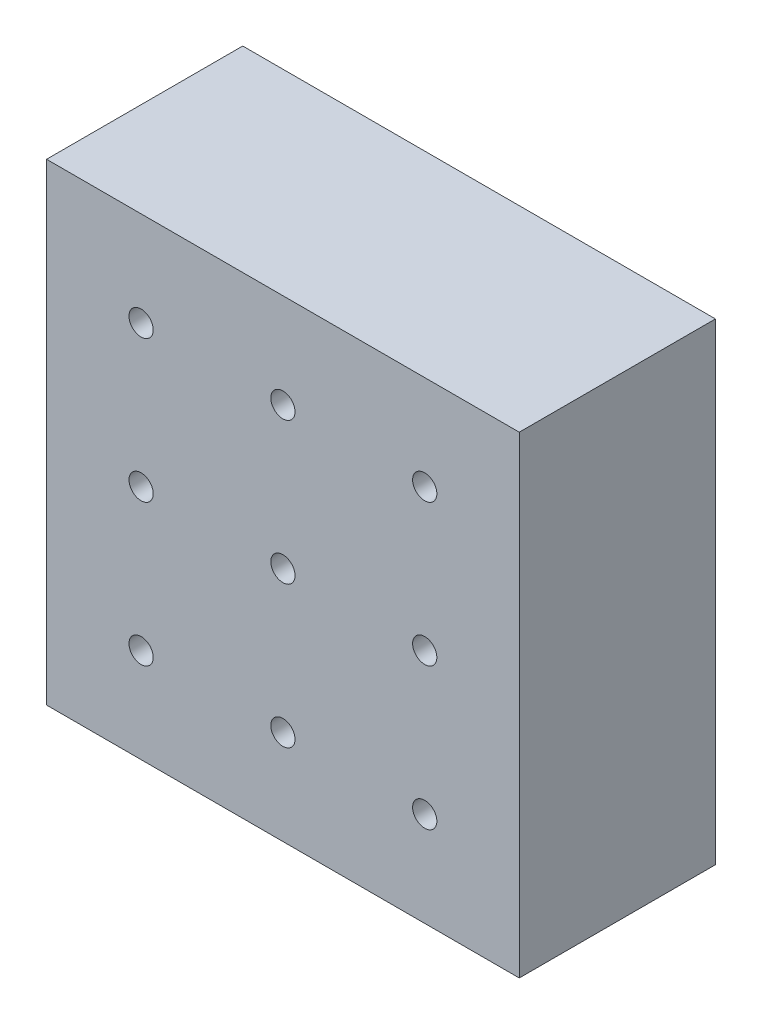
ISO-10303-21;
HEADER;
FILE_DESCRIPTION(('STEP AP214'),'2;1');
FILE_NAME('part.step','',(''),(''),'','','');
FILE_SCHEMA(('AUTOMOTIVE_DESIGN { 1 0 10303 214 1 1 1 1 }'));
ENDSEC;
DATA;
#1=APPLICATION_CONTEXT('core data for automotive mechanical design processes');
#2=APPLICATION_PROTOCOL_DEFINITION('international standard','automotive_design',2000,#1);
#3=PRODUCT_CONTEXT('',#1,'mechanical');
#4=PRODUCT('Part','Part','',(#3));
#5=PRODUCT_RELATED_PRODUCT_CATEGORY('part','',(#4));
#6=PRODUCT_DEFINITION_FORMATION('','',#4);
#7=PRODUCT_DEFINITION_CONTEXT('part definition',#1,'design');
#8=PRODUCT_DEFINITION('design','',#6,#7);
#9=PRODUCT_DEFINITION_SHAPE('','',#8);
#10=(LENGTH_UNIT() NAMED_UNIT(*) SI_UNIT(.MILLI.,.METRE.));
#11=(NAMED_UNIT(*) PLANE_ANGLE_UNIT() SI_UNIT($,.RADIAN.));
#12=(NAMED_UNIT(*) SI_UNIT($,.STERADIAN.) SOLID_ANGLE_UNIT());
#13=UNCERTAINTY_MEASURE_WITH_UNIT(LENGTH_MEASURE(1.E-05),#10,'distance_accuracy_value','');
#14=(GEOMETRIC_REPRESENTATION_CONTEXT(3) GLOBAL_UNCERTAINTY_ASSIGNED_CONTEXT((#13)) GLOBAL_UNIT_ASSIGNED_CONTEXT((#10,
#11,#12)) REPRESENTATION_CONTEXT('',''));
#15=CARTESIAN_POINT('',(0.,0.,0.));
#16=DIRECTION('',(0.,0.,1.));
#17=DIRECTION('',(1.,0.,0.));
#18=AXIS2_PLACEMENT_3D('',#15,#16,#17);
#19=CARTESIAN_POINT('',(0.,0.,0.));
#20=DIRECTION('',(0.,0.,1.));
#21=DIRECTION('',(1.,0.,0.));
#22=AXIS2_PLACEMENT_3D('',#19,#20,#21);
#23=PLANE('',#22);
#24=DIRECTION('',(-1.,0.,0.));
#25=VECTOR('',#24,1.);
#26=CARTESIAN_POINT('',(-32.,32.,0.));
#27=LINE('',#26,#25);
#28=CARTESIAN_POINT('',(8.,32.,0.));
#29=VERTEX_POINT('',#28);
#30=CARTESIAN_POINT('',(-32.,32.,0.));
#31=VERTEX_POINT('',#30);
#32=EDGE_CURVE('E162',#29,#31,#27,.T.);
#33=ORIENTED_EDGE('',*,*,#32,.F.);
#34=DIRECTION('',(0.,1.,0.));
#35=VECTOR('',#34,1.);
#36=CARTESIAN_POINT('',(8.,-8.00000000000004,0.));
#37=LINE('',#36,#35);
#38=CARTESIAN_POINT('',(8.,-8.00000000000004,0.));
#39=VERTEX_POINT('',#38);
#40=EDGE_CURVE('E53',#39,#29,#37,.T.);
#41=ORIENTED_EDGE('',*,*,#40,.F.);
#42=DIRECTION('',(1.,0.,0.));
#43=VECTOR('',#42,1.);
#44=CARTESIAN_POINT('',(-32.,-8.00000000000004,0.));
#45=LINE('',#44,#43);
#46=CARTESIAN_POINT('',(-32.,-8.00000000000004,0.));
#47=VERTEX_POINT('',#46);
#48=EDGE_CURVE('E65',#47,#39,#45,.T.);
#49=ORIENTED_EDGE('',*,*,#48,.F.);
#50=DIRECTION('',(0.,-1.,0.));
#51=VECTOR('',#50,1.);
#52=CARTESIAN_POINT('',(-32.,-8.00000000000004,0.));
#53=LINE('',#52,#51);
#54=EDGE_CURVE('E168',#31,#47,#53,.T.);
#55=ORIENTED_EDGE('',*,*,#54,.F.);
#56=EDGE_LOOP('',(#33,#41,#49,#55));
#57=FACE_BOUND('',#56,.T.);
#58=CARTESIAN_POINT('',(0.,0.,0.));
#59=DIRECTION('',(0.,0.,1.));
#60=DIRECTION('',(1.,0.,0.));
#61=AXIS2_PLACEMENT_3D('',#58,#59,#60);
#62=CIRCLE('',#61,4.55);
#63=CARTESIAN_POINT('',(4.55,0.,0.));
#64=VERTEX_POINT('',#63);
#65=EDGE_CURVE('E159',#64,#64,#62,.T.);
#66=ORIENTED_EDGE('',*,*,#65,.T.);
#67=EDGE_LOOP('',(#66));
#68=FACE_BOUND('',#67,.T.);
#69=CARTESIAN_POINT('',(0.,12.,0.));
#70=DIRECTION('',(0.,0.,1.));
#71=DIRECTION('',(1.,0.,0.));
#72=AXIS2_PLACEMENT_3D('',#69,#70,#71);
#73=CIRCLE('',#72,4.55);
#74=CARTESIAN_POINT('',(4.55,12.,0.));
#75=VERTEX_POINT('',#74);
#76=EDGE_CURVE('E152',#75,#75,#73,.T.);
#77=ORIENTED_EDGE('',*,*,#76,.T.);
#78=EDGE_LOOP('',(#77));
#79=FACE_BOUND('',#78,.T.);
#80=CARTESIAN_POINT('',(0.,24.,0.));
#81=DIRECTION('',(0.,0.,1.));
#82=DIRECTION('',(1.,0.,0.));
#83=AXIS2_PLACEMENT_3D('',#80,#81,#82);
#84=CIRCLE('',#83,4.55);
#85=CARTESIAN_POINT('',(4.55,24.,0.));
#86=VERTEX_POINT('',#85);
#87=EDGE_CURVE('E149',#86,#86,#84,.T.);
#88=ORIENTED_EDGE('',*,*,#87,.T.);
#89=EDGE_LOOP('',(#88));
#90=FACE_BOUND('',#89,.T.);
#91=CARTESIAN_POINT('',(-12.,12.,0.));
#92=DIRECTION('',(0.,0.,1.));
#93=DIRECTION('',(1.,0.,0.));
#94=AXIS2_PLACEMENT_3D('',#91,#92,#93);
#95=CIRCLE('',#94,4.55);
#96=CARTESIAN_POINT('',(-7.45,12.,0.));
#97=VERTEX_POINT('',#96);
#98=EDGE_CURVE('E145',#97,#97,#95,.T.);
#99=ORIENTED_EDGE('',*,*,#98,.T.);
#100=EDGE_LOOP('',(#99));
#101=FACE_BOUND('',#100,.T.);
#102=CARTESIAN_POINT('',(-12.,24.,0.));
#103=DIRECTION('',(0.,0.,1.));
#104=DIRECTION('',(1.,0.,0.));
#105=AXIS2_PLACEMENT_3D('',#102,#103,#104);
#106=CIRCLE('',#105,4.55);
#107=CARTESIAN_POINT('',(-7.45,24.,0.));
#108=VERTEX_POINT('',#107);
#109=EDGE_CURVE('E136',#108,#108,#106,.T.);
#110=ORIENTED_EDGE('',*,*,#109,.T.);
#111=EDGE_LOOP('',(#110));
#112=FACE_BOUND('',#111,.T.);
#113=CARTESIAN_POINT('',(-24.,11.9999999999999,0.));
#114=DIRECTION('',(0.,0.,1.));
#115=DIRECTION('',(1.,0.,0.));
#116=AXIS2_PLACEMENT_3D('',#113,#114,#115);
#117=CIRCLE('',#116,4.55);
#118=CARTESIAN_POINT('',(-19.45,11.9999999999999,0.));
#119=VERTEX_POINT('',#118);
#120=EDGE_CURVE('E127',#119,#119,#117,.T.);
#121=ORIENTED_EDGE('',*,*,#120,.T.);
#122=EDGE_LOOP('',(#121));
#123=FACE_BOUND('',#122,.T.);
#124=CARTESIAN_POINT('',(-24.,23.9999999999999,0.));
#125=DIRECTION('',(0.,0.,1.));
#126=DIRECTION('',(1.,0.,0.));
#127=AXIS2_PLACEMENT_3D('',#124,#125,#126);
#128=CIRCLE('',#127,4.55);
#129=CARTESIAN_POINT('',(-19.45,23.9999999999999,0.));
#130=VERTEX_POINT('',#129);
#131=EDGE_CURVE('E125',#130,#130,#128,.T.);
#132=ORIENTED_EDGE('',*,*,#131,.T.);
#133=EDGE_LOOP('',(#132));
#134=FACE_BOUND('',#133,.T.);
#135=CARTESIAN_POINT('',(-12.,0.,0.));
#136=DIRECTION('',(0.,0.,1.));
#137=DIRECTION('',(1.,0.,0.));
#138=AXIS2_PLACEMENT_3D('',#135,#136,#137);
#139=CIRCLE('',#138,4.55);
#140=CARTESIAN_POINT('',(-7.45,0.,0.));
#141=VERTEX_POINT('',#140);
#142=EDGE_CURVE('E120',#141,#141,#139,.T.);
#143=ORIENTED_EDGE('',*,*,#142,.T.);
#144=EDGE_LOOP('',(#143));
#145=FACE_BOUND('',#144,.T.);
#146=CARTESIAN_POINT('',(-24.,0.,0.));
#147=DIRECTION('',(0.,0.,1.));
#148=DIRECTION('',(1.,0.,0.));
#149=AXIS2_PLACEMENT_3D('',#146,#147,#148);
#150=CIRCLE('',#149,4.55);
#151=CARTESIAN_POINT('',(-19.45,0.,0.));
#152=VERTEX_POINT('',#151);
#153=EDGE_CURVE('E114',#152,#152,#150,.T.);
#154=ORIENTED_EDGE('',*,*,#153,.T.);
#155=EDGE_LOOP('',(#154));
#156=FACE_BOUND('',#155,.T.);
#157=ADVANCED_FACE('F39',(#57,#68,#79,#90,#101,#112,#123,#134,#145,#156),#23,.F.);
#158=CARTESIAN_POINT('',(-32.,32.,1.6));
#159=DIRECTION('',(0.,-1.,0.));
#160=DIRECTION('',(1.,0.,0.));
#161=AXIS2_PLACEMENT_3D('',#158,#159,#160);
#162=PLANE('',#161);
#163=ORIENTED_EDGE('',*,*,#32,.T.);
#164=DIRECTION('',(0.,0.,-1.));
#165=VECTOR('',#164,1.);
#166=CARTESIAN_POINT('',(-32.,32.,1.6));
#167=LINE('',#166,#165);
#168=CARTESIAN_POINT('',(-32.0000000000001,31.9999999999999,16.6));
#169=VERTEX_POINT('',#168);
#170=EDGE_CURVE('E11',#169,#31,#167,.T.);
#171=ORIENTED_EDGE('',*,*,#170,.F.);
#172=DIRECTION('',(-1.,0.,0.));
#173=VECTOR('',#172,1.);
#174=CARTESIAN_POINT('',(-32.0000000000001,31.9999999999999,16.6));
#175=LINE('',#174,#173);
#176=CARTESIAN_POINT('',(8.,31.9999999999999,16.6));
#177=VERTEX_POINT('',#176);
#178=EDGE_CURVE('E89',#177,#169,#175,.T.);
#179=ORIENTED_EDGE('',*,*,#178,.F.);
#180=DIRECTION('',(0.,0.,-1.));
#181=VECTOR('',#180,1.);
#182=CARTESIAN_POINT('',(8.,32.,1.6));
#183=LINE('',#182,#181);
#184=EDGE_CURVE('E80',#177,#29,#183,.T.);
#185=ORIENTED_EDGE('',*,*,#184,.T.);
#186=EDGE_LOOP('',(#163,#171,#179,#185));
#187=FACE_BOUND('',#186,.T.);
#188=ADVANCED_FACE('F41',(#187),#162,.F.);
#189=CARTESIAN_POINT('',(-32.,-8.00000000000004,1.6));
#190=DIRECTION('',(1.,0.,0.));
#191=DIRECTION('',(0.,0.,-1.));
#192=AXIS2_PLACEMENT_3D('',#189,#190,#191);
#193=PLANE('',#192);
#194=ORIENTED_EDGE('',*,*,#54,.T.);
#195=DIRECTION('',(0.,0.,-1.));
#196=VECTOR('',#195,1.);
#197=CARTESIAN_POINT('',(-32.,-8.00000000000004,1.6));
#198=LINE('',#197,#196);
#199=CARTESIAN_POINT('',(-32.0000000000001,-8.00000000000004,16.6));
#200=VERTEX_POINT('',#199);
#201=EDGE_CURVE('E50',#200,#47,#198,.T.);
#202=ORIENTED_EDGE('',*,*,#201,.F.);
#203=DIRECTION('',(0.,-1.,0.));
#204=VECTOR('',#203,1.);
#205=CARTESIAN_POINT('',(-32.0000000000001,31.9999999999999,16.6));
#206=LINE('',#205,#204);
#207=EDGE_CURVE('E92',#169,#200,#206,.T.);
#208=ORIENTED_EDGE('',*,*,#207,.F.);
#209=ORIENTED_EDGE('',*,*,#170,.T.);
#210=EDGE_LOOP('',(#194,#202,#208,#209));
#211=FACE_BOUND('',#210,.T.);
#212=ADVANCED_FACE('F174',(#211),#193,.F.);
#213=CARTESIAN_POINT('',(-32.,-8.00000000000004,1.6));
#214=DIRECTION('',(0.,1.,0.));
#215=DIRECTION('',(-1.,0.,0.));
#216=AXIS2_PLACEMENT_3D('',#213,#214,#215);
#217=PLANE('',#216);
#218=ORIENTED_EDGE('',*,*,#48,.T.);
#219=DIRECTION('',(0.,0.,-1.));
#220=VECTOR('',#219,1.);
#221=CARTESIAN_POINT('',(8.,-8.00000000000004,1.6));
#222=LINE('',#221,#220);
#223=CARTESIAN_POINT('',(8.,-8.00000000000004,16.6));
#224=VERTEX_POINT('',#223);
#225=EDGE_CURVE('E90',#224,#39,#222,.T.);
#226=ORIENTED_EDGE('',*,*,#225,.F.);
#227=DIRECTION('',(1.,0.,0.));
#228=VECTOR('',#227,1.);
#229=CARTESIAN_POINT('',(-32.0000000000001,-8.00000000000004,16.6));
#230=LINE('',#229,#228);
#231=EDGE_CURVE('E99',#200,#224,#230,.T.);
#232=ORIENTED_EDGE('',*,*,#231,.F.);
#233=ORIENTED_EDGE('',*,*,#201,.T.);
#234=EDGE_LOOP('',(#218,#226,#232,#233));
#235=FACE_BOUND('',#234,.T.);
#236=ADVANCED_FACE('F169',(#235),#217,.F.);
#237=CARTESIAN_POINT('',(8.,-8.00000000000004,1.6));
#238=DIRECTION('',(-1.,0.,0.));
#239=DIRECTION('',(0.,0.,1.));
#240=AXIS2_PLACEMENT_3D('',#237,#238,#239);
#241=PLANE('',#240);
#242=ORIENTED_EDGE('',*,*,#40,.T.);
#243=ORIENTED_EDGE('',*,*,#184,.F.);
#244=DIRECTION('',(0.,1.,0.));
#245=VECTOR('',#244,1.);
#246=CARTESIAN_POINT('',(8.,31.9999999999999,16.6));
#247=LINE('',#246,#245);
#248=EDGE_CURVE('E81',#224,#177,#247,.T.);
#249=ORIENTED_EDGE('',*,*,#248,.F.);
#250=ORIENTED_EDGE('',*,*,#225,.T.);
#251=EDGE_LOOP('',(#242,#243,#249,#250));
#252=FACE_BOUND('',#251,.T.);
#253=ADVANCED_FACE('F83',(#252),#241,.F.);
#254=CARTESIAN_POINT('',(0.,0.,1.6));
#255=DIRECTION('',(0.,0.,-1.));
#256=DIRECTION('',(-1.,0.,0.));
#257=AXIS2_PLACEMENT_3D('',#254,#255,#256);
#258=CYLINDRICAL_SURFACE('',#257,4.55);
#259=CARTESIAN_POINT('',(0.,0.,1.6));
#260=DIRECTION('',(0.,0.,1.));
#261=DIRECTION('',(1.,0.,0.));
#262=AXIS2_PLACEMENT_3D('',#259,#260,#261);
#263=CIRCLE('',#262,4.55);
#264=CARTESIAN_POINT('',(4.55,0.,1.6));
#265=VERTEX_POINT('',#264);
#266=EDGE_CURVE('E153',#265,#265,#263,.T.);
#267=ORIENTED_EDGE('',*,*,#266,.T.);
#268=EDGE_LOOP('',(#267));
#269=FACE_BOUND('',#268,.T.);
#270=ORIENTED_EDGE('',*,*,#65,.F.);
#271=EDGE_LOOP('',(#270));
#272=FACE_BOUND('',#271,.T.);
#273=ADVANCED_FACE('F187',(#269,#272),#258,.F.);
#274=CARTESIAN_POINT('',(0.,12.,1.6));
#275=DIRECTION('',(0.,0.,-1.));
#276=DIRECTION('',(-1.,0.,0.));
#277=AXIS2_PLACEMENT_3D('',#274,#275,#276);
#278=CYLINDRICAL_SURFACE('',#277,4.55);
#279=CARTESIAN_POINT('',(0.,12.,1.6));
#280=DIRECTION('',(0.,0.,1.));
#281=DIRECTION('',(1.,0.,0.));
#282=AXIS2_PLACEMENT_3D('',#279,#280,#281);
#283=CIRCLE('',#282,4.55);
#284=CARTESIAN_POINT('',(4.55,12.,1.6));
#285=VERTEX_POINT('',#284);
#286=EDGE_CURVE('E144',#285,#285,#283,.T.);
#287=ORIENTED_EDGE('',*,*,#286,.T.);
#288=EDGE_LOOP('',(#287));
#289=FACE_BOUND('',#288,.T.);
#290=ORIENTED_EDGE('',*,*,#76,.F.);
#291=EDGE_LOOP('',(#290));
#292=FACE_BOUND('',#291,.T.);
#293=ADVANCED_FACE('F191',(#289,#292),#278,.F.);
#294=CARTESIAN_POINT('',(0.,24.,1.6));
#295=DIRECTION('',(0.,0.,-1.));
#296=DIRECTION('',(-1.,0.,0.));
#297=AXIS2_PLACEMENT_3D('',#294,#295,#296);
#298=CYLINDRICAL_SURFACE('',#297,4.55);
#299=CARTESIAN_POINT('',(0.,24.,1.6));
#300=DIRECTION('',(0.,0.,1.));
#301=DIRECTION('',(1.,0.,0.));
#302=AXIS2_PLACEMENT_3D('',#299,#300,#301);
#303=CIRCLE('',#302,4.55);
#304=CARTESIAN_POINT('',(4.55,24.,1.6));
#305=VERTEX_POINT('',#304);
#306=EDGE_CURVE('E137',#305,#305,#303,.T.);
#307=ORIENTED_EDGE('',*,*,#306,.T.);
#308=EDGE_LOOP('',(#307));
#309=FACE_BOUND('',#308,.T.);
#310=ORIENTED_EDGE('',*,*,#87,.F.);
#311=EDGE_LOOP('',(#310));
#312=FACE_BOUND('',#311,.T.);
#313=ADVANCED_FACE('F197',(#309,#312),#298,.F.);
#314=CARTESIAN_POINT('',(-12.,12.,1.6));
#315=DIRECTION('',(0.,0.,-1.));
#316=DIRECTION('',(-1.,0.,0.));
#317=AXIS2_PLACEMENT_3D('',#314,#315,#316);
#318=CYLINDRICAL_SURFACE('',#317,4.55);
#319=CARTESIAN_POINT('',(-12.,12.,1.6));
#320=DIRECTION('',(0.,0.,1.));
#321=DIRECTION('',(1.,0.,0.));
#322=AXIS2_PLACEMENT_3D('',#319,#320,#321);
#323=CIRCLE('',#322,4.55);
#324=CARTESIAN_POINT('',(-7.45,12.,1.6));
#325=VERTEX_POINT('',#324);
#326=EDGE_CURVE('E133',#325,#325,#323,.T.);
#327=ORIENTED_EDGE('',*,*,#326,.T.);
#328=EDGE_LOOP('',(#327));
#329=FACE_BOUND('',#328,.T.);
#330=ORIENTED_EDGE('',*,*,#98,.F.);
#331=EDGE_LOOP('',(#330));
#332=FACE_BOUND('',#331,.T.);
#333=ADVANCED_FACE('F249',(#329,#332),#318,.F.);
#334=CARTESIAN_POINT('',(-12.,24.,1.6));
#335=DIRECTION('',(0.,0.,-1.));
#336=DIRECTION('',(-1.,0.,0.));
#337=AXIS2_PLACEMENT_3D('',#334,#335,#336);
#338=CYLINDRICAL_SURFACE('',#337,4.55);
#339=CARTESIAN_POINT('',(-12.,24.,1.6));
#340=DIRECTION('',(0.,0.,1.));
#341=DIRECTION('',(1.,0.,0.));
#342=AXIS2_PLACEMENT_3D('',#339,#340,#341);
#343=CIRCLE('',#342,4.55);
#344=CARTESIAN_POINT('',(-7.45,24.,1.6));
#345=VERTEX_POINT('',#344);
#346=EDGE_CURVE('E130',#345,#345,#343,.T.);
#347=ORIENTED_EDGE('',*,*,#346,.T.);
#348=EDGE_LOOP('',(#347));
#349=FACE_BOUND('',#348,.T.);
#350=ORIENTED_EDGE('',*,*,#109,.F.);
#351=EDGE_LOOP('',(#350));
#352=FACE_BOUND('',#351,.T.);
#353=ADVANCED_FACE('F244',(#349,#352),#338,.F.);
#354=CARTESIAN_POINT('',(-24.,11.9999999999999,1.6));
#355=DIRECTION('',(0.,0.,-1.));
#356=DIRECTION('',(-1.,0.,0.));
#357=AXIS2_PLACEMENT_3D('',#354,#355,#356);
#358=CYLINDRICAL_SURFACE('',#357,4.55);
#359=CARTESIAN_POINT('',(-24.,11.9999999999999,1.6));
#360=DIRECTION('',(0.,0.,1.));
#361=DIRECTION('',(1.,0.,0.));
#362=AXIS2_PLACEMENT_3D('',#359,#360,#361);
#363=CIRCLE('',#362,4.55);
#364=CARTESIAN_POINT('',(-19.45,11.9999999999999,1.6));
#365=VERTEX_POINT('',#364);
#366=EDGE_CURVE('E123',#365,#365,#363,.T.);
#367=ORIENTED_EDGE('',*,*,#366,.T.);
#368=EDGE_LOOP('',(#367));
#369=FACE_BOUND('',#368,.T.);
#370=ORIENTED_EDGE('',*,*,#120,.F.);
#371=EDGE_LOOP('',(#370));
#372=FACE_BOUND('',#371,.T.);
#373=ADVANCED_FACE('F243',(#369,#372),#358,.F.);
#374=CARTESIAN_POINT('',(-24.,23.9999999999999,1.6));
#375=DIRECTION('',(0.,0.,-1.));
#376=DIRECTION('',(-1.,0.,0.));
#377=AXIS2_PLACEMENT_3D('',#374,#375,#376);
#378=CYLINDRICAL_SURFACE('',#377,4.55);
#379=CARTESIAN_POINT('',(-24.,23.9999999999999,1.6));
#380=DIRECTION('',(0.,0.,1.));
#381=DIRECTION('',(1.,0.,0.));
#382=AXIS2_PLACEMENT_3D('',#379,#380,#381);
#383=CIRCLE('',#382,4.55);
#384=CARTESIAN_POINT('',(-19.45,23.9999999999999,1.6));
#385=VERTEX_POINT('',#384);
#386=EDGE_CURVE('E111',#385,#385,#383,.T.);
#387=ORIENTED_EDGE('',*,*,#386,.T.);
#388=EDGE_LOOP('',(#387));
#389=FACE_BOUND('',#388,.T.);
#390=ORIENTED_EDGE('',*,*,#131,.F.);
#391=EDGE_LOOP('',(#390));
#392=FACE_BOUND('',#391,.T.);
#393=ADVANCED_FACE('F233',(#389,#392),#378,.F.);
#394=CARTESIAN_POINT('',(-12.,0.,1.6));
#395=DIRECTION('',(0.,0.,-1.));
#396=DIRECTION('',(-1.,0.,0.));
#397=AXIS2_PLACEMENT_3D('',#394,#395,#396);
#398=CYLINDRICAL_SURFACE('',#397,4.55);
#399=CARTESIAN_POINT('',(-12.,0.,1.6));
#400=DIRECTION('',(0.,0.,1.));
#401=DIRECTION('',(1.,0.,0.));
#402=AXIS2_PLACEMENT_3D('',#399,#400,#401);
#403=CIRCLE('',#402,4.55);
#404=CARTESIAN_POINT('',(-7.45,0.,1.6));
#405=VERTEX_POINT('',#404);
#406=EDGE_CURVE('E116',#405,#405,#403,.T.);
#407=ORIENTED_EDGE('',*,*,#406,.T.);
#408=EDGE_LOOP('',(#407));
#409=FACE_BOUND('',#408,.T.);
#410=ORIENTED_EDGE('',*,*,#142,.F.);
#411=EDGE_LOOP('',(#410));
#412=FACE_BOUND('',#411,.T.);
#413=ADVANCED_FACE('F222',(#409,#412),#398,.F.);
#414=CARTESIAN_POINT('',(-24.,0.,1.6));
#415=DIRECTION('',(0.,0.,-1.));
#416=DIRECTION('',(-1.,0.,0.));
#417=AXIS2_PLACEMENT_3D('',#414,#415,#416);
#418=CYLINDRICAL_SURFACE('',#417,4.55);
#419=CARTESIAN_POINT('',(-24.,0.,1.6));
#420=DIRECTION('',(0.,0.,1.));
#421=DIRECTION('',(1.,0.,0.));
#422=AXIS2_PLACEMENT_3D('',#419,#420,#421);
#423=CIRCLE('',#422,4.55);
#424=CARTESIAN_POINT('',(-19.45,0.,1.6));
#425=VERTEX_POINT('',#424);
#426=EDGE_CURVE('E109',#425,#425,#423,.T.);
#427=ORIENTED_EDGE('',*,*,#426,.T.);
#428=EDGE_LOOP('',(#427));
#429=FACE_BOUND('',#428,.T.);
#430=ORIENTED_EDGE('',*,*,#153,.F.);
#431=EDGE_LOOP('',(#430));
#432=FACE_BOUND('',#431,.T.);
#433=ADVANCED_FACE('F221',(#429,#432),#418,.F.);
#434=CARTESIAN_POINT('',(0.,0.,1.6));
#435=DIRECTION('',(0.,0.,1.));
#436=DIRECTION('',(1.,0.,0.));
#437=AXIS2_PLACEMENT_3D('',#434,#435,#436);
#438=PLANE('',#437);
#439=CARTESIAN_POINT('',(-12.,0.,1.6));
#440=DIRECTION('',(0.,0.,1.));
#441=DIRECTION('',(1.,0.,0.));
#442=AXIS2_PLACEMENT_3D('',#439,#440,#441);
#443=CIRCLE('',#442,1.025);
#444=CARTESIAN_POINT('',(-10.975,0.,1.6));
#445=VERTEX_POINT('',#444);
#446=EDGE_CURVE('E320',#445,#445,#443,.T.);
#447=ORIENTED_EDGE('',*,*,#446,.T.);
#448=EDGE_LOOP('',(#447));
#449=FACE_BOUND('',#448,.T.);
#450=ORIENTED_EDGE('',*,*,#406,.F.);
#451=EDGE_LOOP('',(#450));
#452=FACE_BOUND('',#451,.T.);
#453=ADVANCED_FACE('F223',(#449,#452),#438,.F.);
#454=CARTESIAN_POINT('',(-24.,11.9999999999998,1.6));
#455=DIRECTION('',(0.,0.,1.));
#456=DIRECTION('',(1.,0.,0.));
#457=AXIS2_PLACEMENT_3D('',#454,#455,#456);
#458=CIRCLE('',#457,1.025);
#459=CARTESIAN_POINT('',(-22.975,11.9999999999998,1.6));
#460=VERTEX_POINT('',#459);
#461=EDGE_CURVE('E297',#460,#460,#458,.T.);
#462=ORIENTED_EDGE('',*,*,#461,.T.);
#463=EDGE_LOOP('',(#462));
#464=FACE_BOUND('',#463,.T.);
#465=ORIENTED_EDGE('',*,*,#366,.F.);
#466=EDGE_LOOP('',(#465));
#467=FACE_BOUND('',#466,.T.);
#468=ADVANCED_FACE('F229',(#464,#467),#438,.F.);
#469=CARTESIAN_POINT('',(-12.,11.9999999999999,1.6));
#470=DIRECTION('',(0.,0.,1.));
#471=DIRECTION('',(1.,0.,0.));
#472=AXIS2_PLACEMENT_3D('',#469,#470,#471);
#473=CIRCLE('',#472,1.025);
#474=CARTESIAN_POINT('',(-10.975,11.9999999999999,1.6));
#475=VERTEX_POINT('',#474);
#476=EDGE_CURVE('E304',#475,#475,#473,.T.);
#477=ORIENTED_EDGE('',*,*,#476,.T.);
#478=EDGE_LOOP('',(#477));
#479=FACE_BOUND('',#478,.T.);
#480=ORIENTED_EDGE('',*,*,#326,.F.);
#481=EDGE_LOOP('',(#480));
#482=FACE_BOUND('',#481,.T.);
#483=ADVANCED_FACE('F365',(#479,#482),#438,.F.);
#484=CARTESIAN_POINT('',(0.,12.,1.6));
#485=DIRECTION('',(0.,0.,1.));
#486=DIRECTION('',(1.,0.,0.));
#487=AXIS2_PLACEMENT_3D('',#484,#485,#486);
#488=CIRCLE('',#487,1.025);
#489=CARTESIAN_POINT('',(1.02499999999996,12.,1.6));
#490=VERTEX_POINT('',#489);
#491=EDGE_CURVE('E282',#490,#490,#488,.T.);
#492=ORIENTED_EDGE('',*,*,#491,.T.);
#493=EDGE_LOOP('',(#492));
#494=FACE_BOUND('',#493,.T.);
#495=ORIENTED_EDGE('',*,*,#286,.F.);
#496=EDGE_LOOP('',(#495));
#497=FACE_BOUND('',#496,.T.);
#498=ADVANCED_FACE('F275',(#494,#497),#438,.F.);
#499=CARTESIAN_POINT('',(0.,0.,1.6));
#500=DIRECTION('',(0.,0.,1.));
#501=DIRECTION('',(1.,0.,0.));
#502=AXIS2_PLACEMENT_3D('',#499,#500,#501);
#503=CIRCLE('',#502,1.025);
#504=CARTESIAN_POINT('',(1.025,0.,1.6));
#505=VERTEX_POINT('',#504);
#506=EDGE_CURVE('E101',#505,#505,#503,.T.);
#507=ORIENTED_EDGE('',*,*,#506,.T.);
#508=EDGE_LOOP('',(#507));
#509=FACE_BOUND('',#508,.T.);
#510=ORIENTED_EDGE('',*,*,#266,.F.);
#511=EDGE_LOOP('',(#510));
#512=FACE_BOUND('',#511,.T.);
#513=ADVANCED_FACE('F264',(#509,#512),#438,.F.);
#514=CARTESIAN_POINT('',(0.,24.,1.6));
#515=DIRECTION('',(0.,0.,1.));
#516=DIRECTION('',(1.,0.,0.));
#517=AXIS2_PLACEMENT_3D('',#514,#515,#516);
#518=CIRCLE('',#517,1.025);
#519=CARTESIAN_POINT('',(1.02499999999992,24.,1.6));
#520=VERTEX_POINT('',#519);
#521=EDGE_CURVE('E276',#520,#520,#518,.T.);
#522=ORIENTED_EDGE('',*,*,#521,.T.);
#523=EDGE_LOOP('',(#522));
#524=FACE_BOUND('',#523,.T.);
#525=ORIENTED_EDGE('',*,*,#306,.F.);
#526=EDGE_LOOP('',(#525));
#527=FACE_BOUND('',#526,.T.);
#528=ADVANCED_FACE('F263',(#524,#527),#438,.F.);
#529=CARTESIAN_POINT('',(-12.0000000000001,23.9999999999999,1.6));
#530=DIRECTION('',(0.,0.,1.));
#531=DIRECTION('',(1.,0.,0.));
#532=AXIS2_PLACEMENT_3D('',#529,#530,#531);
#533=CIRCLE('',#532,1.025);
#534=CARTESIAN_POINT('',(-10.9750000000001,23.9999999999999,1.6));
#535=VERTEX_POINT('',#534);
#536=EDGE_CURVE('E291',#535,#535,#533,.T.);
#537=ORIENTED_EDGE('',*,*,#536,.T.);
#538=EDGE_LOOP('',(#537));
#539=FACE_BOUND('',#538,.T.);
#540=ORIENTED_EDGE('',*,*,#346,.F.);
#541=EDGE_LOOP('',(#540));
#542=FACE_BOUND('',#541,.T.);
#543=ADVANCED_FACE('F261',(#539,#542),#438,.F.);
#544=CARTESIAN_POINT('',(-24.0000000000001,23.9999999999998,1.6));
#545=DIRECTION('',(0.,0.,1.));
#546=DIRECTION('',(1.,0.,0.));
#547=AXIS2_PLACEMENT_3D('',#544,#545,#546);
#548=CIRCLE('',#547,1.025);
#549=CARTESIAN_POINT('',(-22.9750000000001,23.9999999999998,1.6));
#550=VERTEX_POINT('',#549);
#551=EDGE_CURVE('E290',#550,#550,#548,.T.);
#552=ORIENTED_EDGE('',*,*,#551,.T.);
#553=EDGE_LOOP('',(#552));
#554=FACE_BOUND('',#553,.T.);
#555=ORIENTED_EDGE('',*,*,#386,.F.);
#556=EDGE_LOOP('',(#555));
#557=FACE_BOUND('',#556,.T.);
#558=ADVANCED_FACE('F269',(#554,#557),#438,.F.);
#559=CARTESIAN_POINT('',(-24.,-1.6759110426447E-13,1.6));
#560=DIRECTION('',(0.,0.,1.));
#561=DIRECTION('',(1.,0.,0.));
#562=AXIS2_PLACEMENT_3D('',#559,#560,#561);
#563=CIRCLE('',#562,1.025);
#564=CARTESIAN_POINT('',(-22.975,-1.6759110426447E-13,1.6));
#565=VERTEX_POINT('',#564);
#566=EDGE_CURVE('E311',#565,#565,#563,.T.);
#567=ORIENTED_EDGE('',*,*,#566,.T.);
#568=EDGE_LOOP('',(#567));
#569=FACE_BOUND('',#568,.T.);
#570=ORIENTED_EDGE('',*,*,#426,.F.);
#571=EDGE_LOOP('',(#570));
#572=FACE_BOUND('',#571,.T.);
#573=ADVANCED_FACE('F232',(#569,#572),#438,.F.);
#574=CARTESIAN_POINT('',(0.,0.,16.6));
#575=DIRECTION('',(0.,0.,1.));
#576=DIRECTION('',(1.,0.,0.));
#577=AXIS2_PLACEMENT_3D('',#574,#575,#576);
#578=PLANE('',#577);
#579=CARTESIAN_POINT('',(0.,12.,16.6));
#580=DIRECTION('',(0.,0.,1.));
#581=DIRECTION('',(1.,0.,0.));
#582=AXIS2_PLACEMENT_3D('',#579,#580,#581);
#583=CIRCLE('',#582,1.025);
#584=CARTESIAN_POINT('',(1.02499999999996,12.,16.6));
#585=VERTEX_POINT('',#584);
#586=EDGE_CURVE('E281',#585,#585,#583,.T.);
#587=ORIENTED_EDGE('',*,*,#586,.F.);
#588=EDGE_LOOP('',(#587));
#589=FACE_BOUND('',#588,.T.);
#590=CARTESIAN_POINT('',(-12.0000000000001,23.9999999999999,16.6));
#591=DIRECTION('',(0.,0.,1.));
#592=DIRECTION('',(1.,0.,0.));
#593=AXIS2_PLACEMENT_3D('',#590,#591,#592);
#594=CIRCLE('',#593,1.025);
#595=CARTESIAN_POINT('',(-10.9750000000001,23.9999999999999,16.6));
#596=VERTEX_POINT('',#595);
#597=EDGE_CURVE('E298',#596,#596,#594,.T.);
#598=ORIENTED_EDGE('',*,*,#597,.F.);
#599=EDGE_LOOP('',(#598));
#600=FACE_BOUND('',#599,.T.);
#601=CARTESIAN_POINT('',(-12.,11.9999999999999,16.6));
#602=DIRECTION('',(0.,0.,1.));
#603=DIRECTION('',(1.,0.,0.));
#604=AXIS2_PLACEMENT_3D('',#601,#602,#603);
#605=CIRCLE('',#604,1.025);
#606=CARTESIAN_POINT('',(-10.975,11.9999999999999,16.6));
#607=VERTEX_POINT('',#606);
#608=EDGE_CURVE('E306',#607,#607,#605,.T.);
#609=ORIENTED_EDGE('',*,*,#608,.F.);
#610=EDGE_LOOP('',(#609));
#611=FACE_BOUND('',#610,.T.);
#612=CARTESIAN_POINT('',(-12.,0.,16.6));
#613=DIRECTION('',(0.,0.,1.));
#614=DIRECTION('',(1.,0.,0.));
#615=AXIS2_PLACEMENT_3D('',#612,#613,#614);
#616=CIRCLE('',#615,1.025);
#617=CARTESIAN_POINT('',(-10.975,0.,16.6));
#618=VERTEX_POINT('',#617);
#619=EDGE_CURVE('E319',#618,#618,#616,.T.);
#620=ORIENTED_EDGE('',*,*,#619,.F.);
#621=EDGE_LOOP('',(#620));
#622=FACE_BOUND('',#621,.T.);
#623=ORIENTED_EDGE('',*,*,#248,.T.);
#624=ORIENTED_EDGE('',*,*,#178,.T.);
#625=ORIENTED_EDGE('',*,*,#207,.T.);
#626=ORIENTED_EDGE('',*,*,#231,.T.);
#627=EDGE_LOOP('',(#623,#624,#625,#626));
#628=FACE_BOUND('',#627,.T.);
#629=CARTESIAN_POINT('',(0.,0.,16.6));
#630=DIRECTION('',(0.,0.,1.));
#631=DIRECTION('',(1.,0.,0.));
#632=AXIS2_PLACEMENT_3D('',#629,#630,#631);
#633=CIRCLE('',#632,1.025);
#634=CARTESIAN_POINT('',(1.025,0.,16.6));
#635=VERTEX_POINT('',#634);
#636=EDGE_CURVE('E102',#635,#635,#633,.T.);
#637=ORIENTED_EDGE('',*,*,#636,.F.);
#638=EDGE_LOOP('',(#637));
#639=FACE_BOUND('',#638,.T.);
#640=CARTESIAN_POINT('',(-24.,-1.6759110426447E-13,16.6));
#641=DIRECTION('',(0.,0.,1.));
#642=DIRECTION('',(1.,0.,0.));
#643=AXIS2_PLACEMENT_3D('',#640,#641,#642);
#644=CIRCLE('',#643,1.025);
#645=CARTESIAN_POINT('',(-22.975,-1.6759110426447E-13,16.6));
#646=VERTEX_POINT('',#645);
#647=EDGE_CURVE('E312',#646,#646,#644,.T.);
#648=ORIENTED_EDGE('',*,*,#647,.F.);
#649=EDGE_LOOP('',(#648));
#650=FACE_BOUND('',#649,.T.);
#651=CARTESIAN_POINT('',(-24.,11.9999999999998,16.6));
#652=DIRECTION('',(0.,0.,1.));
#653=DIRECTION('',(1.,0.,0.));
#654=AXIS2_PLACEMENT_3D('',#651,#652,#653);
#655=CIRCLE('',#654,1.025);
#656=CARTESIAN_POINT('',(-22.975,11.9999999999998,16.6));
#657=VERTEX_POINT('',#656);
#658=EDGE_CURVE('E302',#657,#657,#655,.T.);
#659=ORIENTED_EDGE('',*,*,#658,.F.);
#660=EDGE_LOOP('',(#659));
#661=FACE_BOUND('',#660,.T.);
#662=CARTESIAN_POINT('',(-24.0000000000001,23.9999999999998,16.6));
#663=DIRECTION('',(0.,0.,1.));
#664=DIRECTION('',(1.,0.,0.));
#665=AXIS2_PLACEMENT_3D('',#662,#663,#664);
#666=CIRCLE('',#665,1.025);
#667=CARTESIAN_POINT('',(-22.9750000000001,23.9999999999998,16.6));
#668=VERTEX_POINT('',#667);
#669=EDGE_CURVE('E289',#668,#668,#666,.T.);
#670=ORIENTED_EDGE('',*,*,#669,.F.);
#671=EDGE_LOOP('',(#670));
#672=FACE_BOUND('',#671,.T.);
#673=CARTESIAN_POINT('',(0.,24.,16.6));
#674=DIRECTION('',(0.,0.,1.));
#675=DIRECTION('',(1.,0.,0.));
#676=AXIS2_PLACEMENT_3D('',#673,#674,#675);
#677=CIRCLE('',#676,1.025);
#678=CARTESIAN_POINT('',(1.02499999999992,24.,16.6));
#679=VERTEX_POINT('',#678);
#680=EDGE_CURVE('E277',#679,#679,#677,.T.);
#681=ORIENTED_EDGE('',*,*,#680,.F.);
#682=EDGE_LOOP('',(#681));
#683=FACE_BOUND('',#682,.T.);
#684=ADVANCED_FACE('F100',(#589,#600,#611,#622,#628,#639,#650,#661,#672,#683),#578,.T.);
#685=CARTESIAN_POINT('',(0.,0.,16.6));
#686=DIRECTION('',(0.,0.,-1.));
#687=DIRECTION('',(-1.,0.,0.));
#688=AXIS2_PLACEMENT_3D('',#685,#686,#687);
#689=CYLINDRICAL_SURFACE('',#688,1.025);
#690=ORIENTED_EDGE('',*,*,#636,.T.);
#691=EDGE_LOOP('',(#690));
#692=FACE_BOUND('',#691,.T.);
#693=ORIENTED_EDGE('',*,*,#506,.F.);
#694=EDGE_LOOP('',(#693));
#695=FACE_BOUND('',#694,.T.);
#696=ADVANCED_FACE('F328',(#692,#695),#689,.F.);
#697=CARTESIAN_POINT('',(-12.,0.,16.6));
#698=DIRECTION('',(0.,0.,-1.));
#699=DIRECTION('',(-1.,0.,0.));
#700=AXIS2_PLACEMENT_3D('',#697,#698,#699);
#701=CYLINDRICAL_SURFACE('',#700,1.025);
#702=ORIENTED_EDGE('',*,*,#619,.T.);
#703=EDGE_LOOP('',(#702));
#704=FACE_BOUND('',#703,.T.);
#705=ORIENTED_EDGE('',*,*,#446,.F.);
#706=EDGE_LOOP('',(#705));
#707=FACE_BOUND('',#706,.T.);
#708=ADVANCED_FACE('F330',(#704,#707),#701,.F.);
#709=CARTESIAN_POINT('',(-24.,-1.6759110426447E-13,16.6));
#710=DIRECTION('',(0.,0.,-1.));
#711=DIRECTION('',(-1.,0.,0.));
#712=AXIS2_PLACEMENT_3D('',#709,#710,#711);
#713=CYLINDRICAL_SURFACE('',#712,1.025);
#714=ORIENTED_EDGE('',*,*,#647,.T.);
#715=EDGE_LOOP('',(#714));
#716=FACE_BOUND('',#715,.T.);
#717=ORIENTED_EDGE('',*,*,#566,.F.);
#718=EDGE_LOOP('',(#717));
#719=FACE_BOUND('',#718,.T.);
#720=ADVANCED_FACE('F326',(#716,#719),#713,.F.);
#721=CARTESIAN_POINT('',(-12.,11.9999999999999,16.6));
#722=DIRECTION('',(0.,0.,-1.));
#723=DIRECTION('',(-1.,0.,0.));
#724=AXIS2_PLACEMENT_3D('',#721,#722,#723);
#725=CYLINDRICAL_SURFACE('',#724,1.025);
#726=ORIENTED_EDGE('',*,*,#608,.T.);
#727=EDGE_LOOP('',(#726));
#728=FACE_BOUND('',#727,.T.);
#729=ORIENTED_EDGE('',*,*,#476,.F.);
#730=EDGE_LOOP('',(#729));
#731=FACE_BOUND('',#730,.T.);
#732=ADVANCED_FACE('F340',(#728,#731),#725,.F.);
#733=CARTESIAN_POINT('',(-24.,11.9999999999998,16.6));
#734=DIRECTION('',(0.,0.,-1.));
#735=DIRECTION('',(-1.,0.,0.));
#736=AXIS2_PLACEMENT_3D('',#733,#734,#735);
#737=CYLINDRICAL_SURFACE('',#736,1.025);
#738=ORIENTED_EDGE('',*,*,#658,.T.);
#739=EDGE_LOOP('',(#738));
#740=FACE_BOUND('',#739,.T.);
#741=ORIENTED_EDGE('',*,*,#461,.F.);
#742=EDGE_LOOP('',(#741));
#743=FACE_BOUND('',#742,.T.);
#744=ADVANCED_FACE('F357',(#740,#743),#737,.F.);
#745=CARTESIAN_POINT('',(-12.0000000000001,23.9999999999999,16.6));
#746=DIRECTION('',(0.,0.,-1.));
#747=DIRECTION('',(-1.,0.,0.));
#748=AXIS2_PLACEMENT_3D('',#745,#746,#747);
#749=CYLINDRICAL_SURFACE('',#748,1.025);
#750=ORIENTED_EDGE('',*,*,#597,.T.);
#751=EDGE_LOOP('',(#750));
#752=FACE_BOUND('',#751,.T.);
#753=ORIENTED_EDGE('',*,*,#536,.F.);
#754=EDGE_LOOP('',(#753));
#755=FACE_BOUND('',#754,.T.);
#756=ADVANCED_FACE('F382',(#752,#755),#749,.F.);
#757=CARTESIAN_POINT('',(-24.0000000000001,23.9999999999998,16.6));
#758=DIRECTION('',(0.,0.,-1.));
#759=DIRECTION('',(-1.,0.,0.));
#760=AXIS2_PLACEMENT_3D('',#757,#758,#759);
#761=CYLINDRICAL_SURFACE('',#760,1.025);
#762=ORIENTED_EDGE('',*,*,#669,.T.);
#763=EDGE_LOOP('',(#762));
#764=FACE_BOUND('',#763,.T.);
#765=ORIENTED_EDGE('',*,*,#551,.F.);
#766=EDGE_LOOP('',(#765));
#767=FACE_BOUND('',#766,.T.);
#768=ADVANCED_FACE('F390',(#764,#767),#761,.F.);
#769=CARTESIAN_POINT('',(0.,12.,16.6));
#770=DIRECTION('',(0.,0.,-1.));
#771=DIRECTION('',(-1.,0.,0.));
#772=AXIS2_PLACEMENT_3D('',#769,#770,#771);
#773=CYLINDRICAL_SURFACE('',#772,1.025);
#774=ORIENTED_EDGE('',*,*,#586,.T.);
#775=EDGE_LOOP('',(#774));
#776=FACE_BOUND('',#775,.T.);
#777=ORIENTED_EDGE('',*,*,#491,.F.);
#778=EDGE_LOOP('',(#777));
#779=FACE_BOUND('',#778,.T.);
#780=ADVANCED_FACE('F391',(#776,#779),#773,.F.);
#781=CARTESIAN_POINT('',(0.,24.,16.6));
#782=DIRECTION('',(0.,0.,-1.));
#783=DIRECTION('',(-1.,0.,0.));
#784=AXIS2_PLACEMENT_3D('',#781,#782,#783);
#785=CYLINDRICAL_SURFACE('',#784,1.025);
#786=ORIENTED_EDGE('',*,*,#680,.T.);
#787=EDGE_LOOP('',(#786));
#788=FACE_BOUND('',#787,.T.);
#789=ORIENTED_EDGE('',*,*,#521,.F.);
#790=EDGE_LOOP('',(#789));
#791=FACE_BOUND('',#790,.T.);
#792=ADVANCED_FACE('F400',(#788,#791),#785,.F.);
#793=CLOSED_SHELL('',(#157,#188,#212,#236,#253,#273,#293,#313,#333,#353,#373,#393,#413,#433,
#453,#468,#483,#498,#513,#528,#543,#558,#573,#684,#696,#708,#720,#732,#744,#756,#768,#780,#792));
#794=MANIFOLD_SOLID_BREP('B2',#793);
#795=ADVANCED_BREP_SHAPE_REPRESENTATION('',(#18,#794),#14);
#796=SHAPE_DEFINITION_REPRESENTATION(#9,#795);
ENDSEC;
END-ISO-10303-21;
